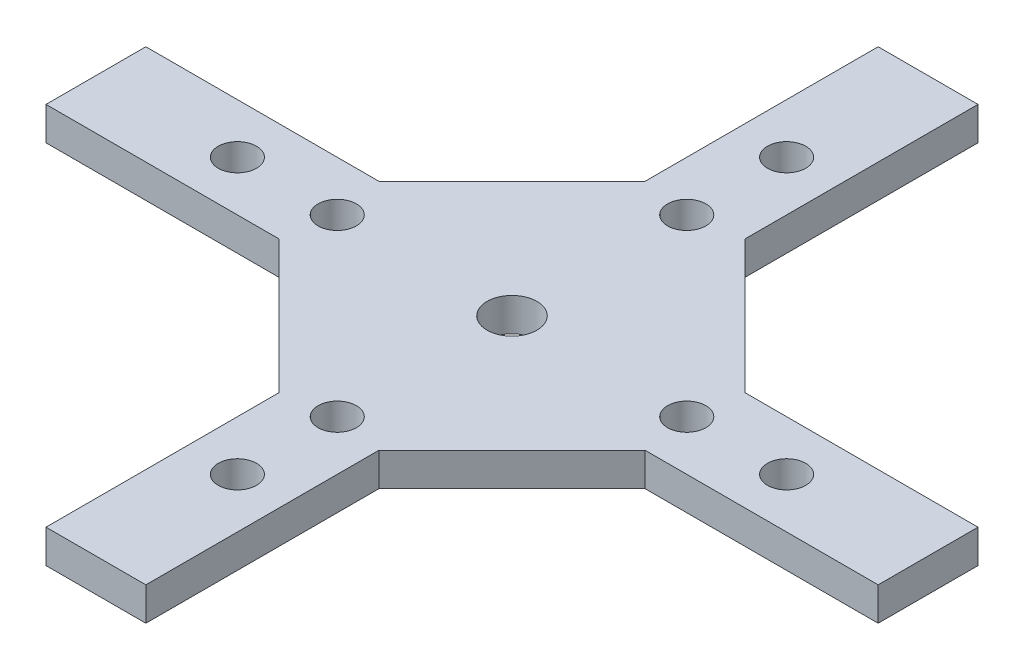
ISO-10303-21;
HEADER;
FILE_DESCRIPTION(('STEP AP214'),'2;1');
FILE_NAME('part.step','',(''),(''),'','','');
FILE_SCHEMA(('AUTOMOTIVE_DESIGN { 1 0 10303 214 1 1 1 1 }'));
ENDSEC;
DATA;
#1=APPLICATION_CONTEXT('core data for automotive mechanical design processes');
#2=APPLICATION_PROTOCOL_DEFINITION('international standard','automotive_design',2000,#1);
#3=PRODUCT_CONTEXT('',#1,'mechanical');
#4=PRODUCT('Part','Part','',(#3));
#5=PRODUCT_RELATED_PRODUCT_CATEGORY('part','',(#4));
#6=PRODUCT_DEFINITION_FORMATION('','',#4);
#7=PRODUCT_DEFINITION_CONTEXT('part definition',#1,'design');
#8=PRODUCT_DEFINITION('design','',#6,#7);
#9=PRODUCT_DEFINITION_SHAPE('','',#8);
#10=(LENGTH_UNIT() NAMED_UNIT(*) SI_UNIT(.MILLI.,.METRE.));
#11=(NAMED_UNIT(*) PLANE_ANGLE_UNIT() SI_UNIT($,.RADIAN.));
#12=(NAMED_UNIT(*) SI_UNIT($,.STERADIAN.) SOLID_ANGLE_UNIT());
#13=UNCERTAINTY_MEASURE_WITH_UNIT(LENGTH_MEASURE(1.E-05),#10,'distance_accuracy_value','');
#14=(GEOMETRIC_REPRESENTATION_CONTEXT(3) GLOBAL_UNCERTAINTY_ASSIGNED_CONTEXT((#13)) GLOBAL_UNIT_ASSIGNED_CONTEXT((#10,
#11,#12)) REPRESENTATION_CONTEXT('',''));
#15=CARTESIAN_POINT('',(0.,0.,0.));
#16=DIRECTION('',(0.,0.,1.));
#17=DIRECTION('',(1.,0.,0.));
#18=AXIS2_PLACEMENT_3D('',#15,#16,#17);
#19=CARTESIAN_POINT('',(0.,2.,3.));
#20=DIRECTION('',(0.,0.,-1.));
#21=DIRECTION('',(-1.,0.,0.));
#22=AXIS2_PLACEMENT_3D('',#19,#20,#21);
#23=PLANE('',#22);
#24=DIRECTION('',(1.,0.,0.));
#25=VECTOR('',#24,1.);
#26=CARTESIAN_POINT('',(0.,0.,3.));
#27=LINE('',#26,#25);
#28=CARTESIAN_POINT('',(-25.,0.,3.));
#29=VERTEX_POINT('',#28);
#30=CARTESIAN_POINT('',(-11.,0.,3.));
#31=VERTEX_POINT('',#30);
#32=EDGE_CURVE('E234',#29,#31,#27,.T.);
#33=ORIENTED_EDGE('',*,*,#32,.T.);
#34=DIRECTION('',(0.,1.,0.));
#35=VECTOR('',#34,1.);
#36=CARTESIAN_POINT('',(-11.,2.,3.));
#37=LINE('',#36,#35);
#38=CARTESIAN_POINT('',(-11.,2.,3.));
#39=VERTEX_POINT('',#38);
#40=EDGE_CURVE('E342',#31,#39,#37,.T.);
#41=ORIENTED_EDGE('',*,*,#40,.T.);
#42=DIRECTION('',(1.,0.,0.));
#43=VECTOR('',#42,1.);
#44=CARTESIAN_POINT('',(0.,2.,3.));
#45=LINE('',#44,#43);
#46=CARTESIAN_POINT('',(-25.,2.,3.));
#47=VERTEX_POINT('',#46);
#48=EDGE_CURVE('E192',#47,#39,#45,.T.);
#49=ORIENTED_EDGE('',*,*,#48,.F.);
#50=DIRECTION('',(0.,-1.,0.));
#51=VECTOR('',#50,1.);
#52=CARTESIAN_POINT('',(-25.,2.,3.));
#53=LINE('',#52,#51);
#54=EDGE_CURVE('E233',#47,#29,#53,.T.);
#55=ORIENTED_EDGE('',*,*,#54,.T.);
#56=EDGE_LOOP('',(#33,#41,#49,#55));
#57=FACE_BOUND('',#56,.T.);
#58=ADVANCED_FACE('F48',(#57),#23,.F.);
#59=CARTESIAN_POINT('',(-3.,2.,0.));
#60=DIRECTION('',(-1.,0.,0.));
#61=DIRECTION('',(0.,0.,1.));
#62=AXIS2_PLACEMENT_3D('',#59,#60,#61);
#63=PLANE('',#62);
#64=DIRECTION('',(0.,0.,-1.));
#65=VECTOR('',#64,1.);
#66=CARTESIAN_POINT('',(-3.,2.,0.));
#67=LINE('',#66,#65);
#68=CARTESIAN_POINT('',(-3.,2.,25.));
#69=VERTEX_POINT('',#68);
#70=CARTESIAN_POINT('',(-3.,2.,11.0000000000001));
#71=VERTEX_POINT('',#70);
#72=EDGE_CURVE('E166',#69,#71,#67,.T.);
#73=ORIENTED_EDGE('',*,*,#72,.T.);
#74=DIRECTION('',(0.,-1.,0.));
#75=VECTOR('',#74,1.);
#76=CARTESIAN_POINT('',(-3.,2.,11.0000000000001));
#77=LINE('',#76,#75);
#78=CARTESIAN_POINT('',(-3.,0.,11.0000000000001));
#79=VERTEX_POINT('',#78);
#80=EDGE_CURVE('E339',#71,#79,#77,.T.);
#81=ORIENTED_EDGE('',*,*,#80,.T.);
#82=DIRECTION('',(0.,0.,-1.));
#83=VECTOR('',#82,1.);
#84=CARTESIAN_POINT('',(-3.,0.,0.));
#85=LINE('',#84,#83);
#86=CARTESIAN_POINT('',(-3.,0.,25.));
#87=VERTEX_POINT('',#86);
#88=EDGE_CURVE('E169',#87,#79,#85,.T.);
#89=ORIENTED_EDGE('',*,*,#88,.F.);
#90=DIRECTION('',(0.,-1.,0.));
#91=VECTOR('',#90,1.);
#92=CARTESIAN_POINT('',(-3.,2.,25.));
#93=LINE('',#92,#91);
#94=EDGE_CURVE('E161',#69,#87,#93,.T.);
#95=ORIENTED_EDGE('',*,*,#94,.F.);
#96=EDGE_LOOP('',(#73,#81,#89,#95));
#97=FACE_BOUND('',#96,.T.);
#98=ADVANCED_FACE('F163',(#97),#63,.T.);
#99=CARTESIAN_POINT('',(0.,2.,25.));
#100=DIRECTION('',(0.,0.,-1.));
#101=DIRECTION('',(-1.,0.,0.));
#102=AXIS2_PLACEMENT_3D('',#99,#100,#101);
#103=PLANE('',#102);
#104=DIRECTION('',(1.,0.,0.));
#105=VECTOR('',#104,1.);
#106=CARTESIAN_POINT('',(0.,0.,25.));
#107=LINE('',#106,#105);
#108=CARTESIAN_POINT('',(3.,0.,25.));
#109=VERTEX_POINT('',#108);
#110=EDGE_CURVE('E241',#87,#109,#107,.T.);
#111=ORIENTED_EDGE('',*,*,#110,.T.);
#112=DIRECTION('',(0.,-1.,0.));
#113=VECTOR('',#112,1.);
#114=CARTESIAN_POINT('',(3.,2.,25.));
#115=LINE('',#114,#113);
#116=CARTESIAN_POINT('',(3.,2.,25.));
#117=VERTEX_POINT('',#116);
#118=EDGE_CURVE('E174',#117,#109,#115,.T.);
#119=ORIENTED_EDGE('',*,*,#118,.F.);
#120=DIRECTION('',(1.,0.,0.));
#121=VECTOR('',#120,1.);
#122=CARTESIAN_POINT('',(0.,2.,25.));
#123=LINE('',#122,#121);
#124=EDGE_CURVE('E177',#69,#117,#123,.T.);
#125=ORIENTED_EDGE('',*,*,#124,.F.);
#126=ORIENTED_EDGE('',*,*,#94,.T.);
#127=EDGE_LOOP('',(#111,#119,#125,#126));
#128=FACE_BOUND('',#127,.T.);
#129=ADVANCED_FACE('F178',(#128),#103,.F.);
#130=CARTESIAN_POINT('',(3.,2.,0.));
#131=DIRECTION('',(-1.,0.,0.));
#132=DIRECTION('',(0.,0.,1.));
#133=AXIS2_PLACEMENT_3D('',#130,#131,#132);
#134=PLANE('',#133);
#135=DIRECTION('',(0.,0.,-1.));
#136=VECTOR('',#135,1.);
#137=CARTESIAN_POINT('',(3.,0.,0.));
#138=LINE('',#137,#136);
#139=CARTESIAN_POINT('',(3.,0.,11.));
#140=VERTEX_POINT('',#139);
#141=EDGE_CURVE('E244',#109,#140,#138,.T.);
#142=ORIENTED_EDGE('',*,*,#141,.T.);
#143=DIRECTION('',(0.,1.,0.));
#144=VECTOR('',#143,1.);
#145=CARTESIAN_POINT('',(3.,2.,11.));
#146=LINE('',#145,#144);
#147=CARTESIAN_POINT('',(3.,2.,11.));
#148=VERTEX_POINT('',#147);
#149=EDGE_CURVE('E336',#140,#148,#146,.T.);
#150=ORIENTED_EDGE('',*,*,#149,.T.);
#151=DIRECTION('',(0.,0.,-1.));
#152=VECTOR('',#151,1.);
#153=CARTESIAN_POINT('',(3.,2.,0.));
#154=LINE('',#153,#152);
#155=EDGE_CURVE('E184',#117,#148,#154,.T.);
#156=ORIENTED_EDGE('',*,*,#155,.F.);
#157=ORIENTED_EDGE('',*,*,#118,.T.);
#158=EDGE_LOOP('',(#142,#150,#156,#157));
#159=FACE_BOUND('',#158,.T.);
#160=ADVANCED_FACE('F410',(#159),#134,.F.);
#161=CARTESIAN_POINT('',(0.,2.,3.));
#162=DIRECTION('',(0.,0.,-1.));
#163=DIRECTION('',(-1.,0.,0.));
#164=AXIS2_PLACEMENT_3D('',#161,#162,#163);
#165=PLANE('',#164);
#166=DIRECTION('',(1.,0.,0.));
#167=VECTOR('',#166,1.);
#168=CARTESIAN_POINT('',(0.,2.,3.));
#169=LINE('',#168,#167);
#170=CARTESIAN_POINT('',(11.0000000000001,2.,3.));
#171=VERTEX_POINT('',#170);
#172=CARTESIAN_POINT('',(25.,2.,3.));
#173=VERTEX_POINT('',#172);
#174=EDGE_CURVE('E201',#171,#173,#169,.T.);
#175=ORIENTED_EDGE('',*,*,#174,.F.);
#176=DIRECTION('',(0.,-1.,0.));
#177=VECTOR('',#176,1.);
#178=CARTESIAN_POINT('',(11.0000000000001,0.,3.));
#179=LINE('',#178,#177);
#180=CARTESIAN_POINT('',(11.0000000000001,0.,3.));
#181=VERTEX_POINT('',#180);
#182=EDGE_CURVE('E173',#171,#181,#179,.T.);
#183=ORIENTED_EDGE('',*,*,#182,.T.);
#184=DIRECTION('',(1.,0.,0.));
#185=VECTOR('',#184,1.);
#186=CARTESIAN_POINT('',(0.,0.,3.));
#187=LINE('',#186,#185);
#188=CARTESIAN_POINT('',(25.,0.,3.));
#189=VERTEX_POINT('',#188);
#190=EDGE_CURVE('E248',#181,#189,#187,.T.);
#191=ORIENTED_EDGE('',*,*,#190,.T.);
#192=DIRECTION('',(0.,-1.,0.));
#193=VECTOR('',#192,1.);
#194=CARTESIAN_POINT('',(25.,2.,3.));
#195=LINE('',#194,#193);
#196=EDGE_CURVE('E295',#173,#189,#195,.T.);
#197=ORIENTED_EDGE('',*,*,#196,.F.);
#198=EDGE_LOOP('',(#175,#183,#191,#197));
#199=FACE_BOUND('',#198,.T.);
#200=ADVANCED_FACE('F403',(#199),#165,.F.);
#201=CARTESIAN_POINT('',(25.,2.,0.));
#202=DIRECTION('',(-1.,0.,0.));
#203=DIRECTION('',(0.,0.,1.));
#204=AXIS2_PLACEMENT_3D('',#201,#202,#203);
#205=PLANE('',#204);
#206=DIRECTION('',(0.,0.,-1.));
#207=VECTOR('',#206,1.);
#208=CARTESIAN_POINT('',(25.,0.,0.));
#209=LINE('',#208,#207);
#210=CARTESIAN_POINT('',(25.,0.,-3.));
#211=VERTEX_POINT('',#210);
#212=EDGE_CURVE('E251',#189,#211,#209,.T.);
#213=ORIENTED_EDGE('',*,*,#212,.T.);
#214=DIRECTION('',(0.,-1.,0.));
#215=VECTOR('',#214,1.);
#216=CARTESIAN_POINT('',(25.,2.,-3.));
#217=LINE('',#216,#215);
#218=CARTESIAN_POINT('',(25.,2.,-3.));
#219=VERTEX_POINT('',#218);
#220=EDGE_CURVE('E291',#219,#211,#217,.T.);
#221=ORIENTED_EDGE('',*,*,#220,.F.);
#222=DIRECTION('',(0.,0.,-1.));
#223=VECTOR('',#222,1.);
#224=CARTESIAN_POINT('',(25.,2.,0.));
#225=LINE('',#224,#223);
#226=EDGE_CURVE('E204',#173,#219,#225,.T.);
#227=ORIENTED_EDGE('',*,*,#226,.F.);
#228=ORIENTED_EDGE('',*,*,#196,.T.);
#229=EDGE_LOOP('',(#213,#221,#227,#228));
#230=FACE_BOUND('',#229,.T.);
#231=ADVANCED_FACE('F397',(#230),#205,.F.);
#232=CARTESIAN_POINT('',(0.,2.,-3.));
#233=DIRECTION('',(0.,0.,-1.));
#234=DIRECTION('',(-1.,0.,0.));
#235=AXIS2_PLACEMENT_3D('',#232,#233,#234);
#236=PLANE('',#235);
#237=DIRECTION('',(1.,0.,0.));
#238=VECTOR('',#237,1.);
#239=CARTESIAN_POINT('',(0.,0.,-3.));
#240=LINE('',#239,#238);
#241=CARTESIAN_POINT('',(11.,0.,-3.));
#242=VERTEX_POINT('',#241);
#243=EDGE_CURVE('E255',#242,#211,#240,.T.);
#244=ORIENTED_EDGE('',*,*,#243,.F.);
#245=DIRECTION('',(0.,1.,0.));
#246=VECTOR('',#245,1.);
#247=CARTESIAN_POINT('',(11.,2.,-3.));
#248=LINE('',#247,#246);
#249=CARTESIAN_POINT('',(11.,2.,-3.));
#250=VERTEX_POINT('',#249);
#251=EDGE_CURVE('E349',#242,#250,#248,.T.);
#252=ORIENTED_EDGE('',*,*,#251,.T.);
#253=DIRECTION('',(1.,0.,0.));
#254=VECTOR('',#253,1.);
#255=CARTESIAN_POINT('',(0.,2.,-3.));
#256=LINE('',#255,#254);
#257=EDGE_CURVE('E208',#250,#219,#256,.T.);
#258=ORIENTED_EDGE('',*,*,#257,.T.);
#259=ORIENTED_EDGE('',*,*,#220,.T.);
#260=EDGE_LOOP('',(#244,#252,#258,#259));
#261=FACE_BOUND('',#260,.T.);
#262=ADVANCED_FACE('F393',(#261),#236,.T.);
#263=CARTESIAN_POINT('',(3.,2.,0.));
#264=DIRECTION('',(-1.,0.,0.));
#265=DIRECTION('',(0.,0.,1.));
#266=AXIS2_PLACEMENT_3D('',#263,#264,#265);
#267=PLANE('',#266);
#268=DIRECTION('',(0.,0.,-1.));
#269=VECTOR('',#268,1.);
#270=CARTESIAN_POINT('',(3.,2.,0.));
#271=LINE('',#270,#269);
#272=CARTESIAN_POINT('',(3.,2.,-11.0000000000001));
#273=VERTEX_POINT('',#272);
#274=CARTESIAN_POINT('',(3.,2.,-25.));
#275=VERTEX_POINT('',#274);
#276=EDGE_CURVE('E211',#273,#275,#271,.T.);
#277=ORIENTED_EDGE('',*,*,#276,.F.);
#278=DIRECTION('',(0.,-1.,0.));
#279=VECTOR('',#278,1.);
#280=CARTESIAN_POINT('',(3.,2.,-11.0000000000001));
#281=LINE('',#280,#279);
#282=CARTESIAN_POINT('',(3.,0.,-11.0000000000001));
#283=VERTEX_POINT('',#282);
#284=EDGE_CURVE('E345',#273,#283,#281,.T.);
#285=ORIENTED_EDGE('',*,*,#284,.T.);
#286=DIRECTION('',(0.,0.,-1.));
#287=VECTOR('',#286,1.);
#288=CARTESIAN_POINT('',(3.,0.,0.));
#289=LINE('',#288,#287);
#290=CARTESIAN_POINT('',(3.,0.,-25.));
#291=VERTEX_POINT('',#290);
#292=EDGE_CURVE('E258',#283,#291,#289,.T.);
#293=ORIENTED_EDGE('',*,*,#292,.T.);
#294=DIRECTION('',(0.,-1.,0.));
#295=VECTOR('',#294,1.);
#296=CARTESIAN_POINT('',(3.,2.,-25.));
#297=LINE('',#296,#295);
#298=EDGE_CURVE('E287',#275,#291,#297,.T.);
#299=ORIENTED_EDGE('',*,*,#298,.F.);
#300=EDGE_LOOP('',(#277,#285,#293,#299));
#301=FACE_BOUND('',#300,.T.);
#302=ADVANCED_FACE('F384',(#301),#267,.F.);
#303=CARTESIAN_POINT('',(0.,2.,-25.));
#304=DIRECTION('',(0.,0.,-1.));
#305=DIRECTION('',(-1.,0.,0.));
#306=AXIS2_PLACEMENT_3D('',#303,#304,#305);
#307=PLANE('',#306);
#308=DIRECTION('',(1.,0.,0.));
#309=VECTOR('',#308,1.);
#310=CARTESIAN_POINT('',(0.,0.,-25.));
#311=LINE('',#310,#309);
#312=CARTESIAN_POINT('',(-3.,0.,-25.));
#313=VERTEX_POINT('',#312);
#314=EDGE_CURVE('E261',#313,#291,#311,.T.);
#315=ORIENTED_EDGE('',*,*,#314,.F.);
#316=DIRECTION('',(0.,-1.,0.));
#317=VECTOR('',#316,1.);
#318=CARTESIAN_POINT('',(-3.,2.,-25.));
#319=LINE('',#318,#317);
#320=CARTESIAN_POINT('',(-3.,2.,-25.));
#321=VERTEX_POINT('',#320);
#322=EDGE_CURVE('E283',#321,#313,#319,.T.);
#323=ORIENTED_EDGE('',*,*,#322,.F.);
#324=DIRECTION('',(1.,0.,0.));
#325=VECTOR('',#324,1.);
#326=CARTESIAN_POINT('',(0.,2.,-25.));
#327=LINE('',#326,#325);
#328=EDGE_CURVE('E214',#321,#275,#327,.T.);
#329=ORIENTED_EDGE('',*,*,#328,.T.);
#330=ORIENTED_EDGE('',*,*,#298,.T.);
#331=EDGE_LOOP('',(#315,#323,#329,#330));
#332=FACE_BOUND('',#331,.T.);
#333=ADVANCED_FACE('F456',(#332),#307,.T.);
#334=CARTESIAN_POINT('',(-3.,2.,0.));
#335=DIRECTION('',(-1.,0.,0.));
#336=DIRECTION('',(0.,0.,1.));
#337=AXIS2_PLACEMENT_3D('',#334,#335,#336);
#338=PLANE('',#337);
#339=DIRECTION('',(0.,0.,-1.));
#340=VECTOR('',#339,1.);
#341=CARTESIAN_POINT('',(-3.,0.,0.));
#342=LINE('',#341,#340);
#343=CARTESIAN_POINT('',(-3.,0.,-11.));
#344=VERTEX_POINT('',#343);
#345=EDGE_CURVE('E265',#344,#313,#342,.T.);
#346=ORIENTED_EDGE('',*,*,#345,.F.);
#347=DIRECTION('',(0.,1.,0.));
#348=VECTOR('',#347,1.);
#349=CARTESIAN_POINT('',(-3.,2.,-11.));
#350=LINE('',#349,#348);
#351=CARTESIAN_POINT('',(-3.,2.,-11.));
#352=VERTEX_POINT('',#351);
#353=EDGE_CURVE('E65',#344,#352,#350,.T.);
#354=ORIENTED_EDGE('',*,*,#353,.T.);
#355=DIRECTION('',(0.,0.,-1.));
#356=VECTOR('',#355,1.);
#357=CARTESIAN_POINT('',(-3.,2.,0.));
#358=LINE('',#357,#356);
#359=EDGE_CURVE('E218',#352,#321,#358,.T.);
#360=ORIENTED_EDGE('',*,*,#359,.T.);
#361=ORIENTED_EDGE('',*,*,#322,.T.);
#362=EDGE_LOOP('',(#346,#354,#360,#361));
#363=FACE_BOUND('',#362,.T.);
#364=ADVANCED_FACE('F459',(#363),#338,.T.);
#365=CARTESIAN_POINT('',(0.,2.,-3.));
#366=DIRECTION('',(0.,0.,-1.));
#367=DIRECTION('',(-1.,0.,0.));
#368=AXIS2_PLACEMENT_3D('',#365,#366,#367);
#369=PLANE('',#368);
#370=DIRECTION('',(1.,0.,0.));
#371=VECTOR('',#370,1.);
#372=CARTESIAN_POINT('',(0.,2.,-3.));
#373=LINE('',#372,#371);
#374=CARTESIAN_POINT('',(-25.,2.,-3.));
#375=VERTEX_POINT('',#374);
#376=CARTESIAN_POINT('',(-11.0000000000001,2.,-3.));
#377=VERTEX_POINT('',#376);
#378=EDGE_CURVE('E221',#375,#377,#373,.T.);
#379=ORIENTED_EDGE('',*,*,#378,.T.);
#380=DIRECTION('',(0.,-1.,0.));
#381=VECTOR('',#380,1.);
#382=CARTESIAN_POINT('',(-11.0000000000001,0.,-3.));
#383=LINE('',#382,#381);
#384=CARTESIAN_POINT('',(-11.0000000000001,0.,-3.));
#385=VERTEX_POINT('',#384);
#386=EDGE_CURVE('E352',#377,#385,#383,.T.);
#387=ORIENTED_EDGE('',*,*,#386,.T.);
#388=DIRECTION('',(1.,0.,0.));
#389=VECTOR('',#388,1.);
#390=CARTESIAN_POINT('',(0.,0.,-3.));
#391=LINE('',#390,#389);
#392=CARTESIAN_POINT('',(-25.,0.,-3.));
#393=VERTEX_POINT('',#392);
#394=EDGE_CURVE('E268',#393,#385,#391,.T.);
#395=ORIENTED_EDGE('',*,*,#394,.F.);
#396=DIRECTION('',(0.,-1.,0.));
#397=VECTOR('',#396,1.);
#398=CARTESIAN_POINT('',(-25.,2.,-3.));
#399=LINE('',#398,#397);
#400=EDGE_CURVE('E280',#375,#393,#399,.T.);
#401=ORIENTED_EDGE('',*,*,#400,.F.);
#402=EDGE_LOOP('',(#379,#387,#395,#401));
#403=FACE_BOUND('',#402,.T.);
#404=ADVANCED_FACE('F463',(#403),#369,.T.);
#405=CARTESIAN_POINT('',(-25.,2.,0.));
#406=DIRECTION('',(-1.,0.,0.));
#407=DIRECTION('',(0.,0.,1.));
#408=AXIS2_PLACEMENT_3D('',#405,#406,#407);
#409=PLANE('',#408);
#410=DIRECTION('',(0.,0.,-1.));
#411=VECTOR('',#410,1.);
#412=CARTESIAN_POINT('',(-25.,0.,0.));
#413=LINE('',#412,#411);
#414=EDGE_CURVE('E271',#29,#393,#413,.T.);
#415=ORIENTED_EDGE('',*,*,#414,.F.);
#416=ORIENTED_EDGE('',*,*,#54,.F.);
#417=DIRECTION('',(0.,0.,-1.));
#418=VECTOR('',#417,1.);
#419=CARTESIAN_POINT('',(-25.,2.,0.));
#420=LINE('',#419,#418);
#421=EDGE_CURVE('E225',#47,#375,#420,.T.);
#422=ORIENTED_EDGE('',*,*,#421,.T.);
#423=ORIENTED_EDGE('',*,*,#400,.T.);
#424=EDGE_LOOP('',(#415,#416,#422,#423));
#425=FACE_BOUND('',#424,.T.);
#426=ADVANCED_FACE('F466',(#425),#409,.T.);
#427=CARTESIAN_POINT('',(0.,2.,0.));
#428=DIRECTION('',(0.,-1.,0.));
#429=DIRECTION('',(0.,0.,-1.));
#430=AXIS2_PLACEMENT_3D('',#427,#428,#429);
#431=CYLINDRICAL_SURFACE('',#430,1.5);
#432=CARTESIAN_POINT('',(0.,2.,0.));
#433=DIRECTION('',(0.,1.,0.));
#434=DIRECTION('',(0.,0.,1.));
#435=AXIS2_PLACEMENT_3D('',#432,#433,#434);
#436=CIRCLE('',#435,1.5);
#437=CARTESIAN_POINT('',(0.,2.,1.5));
#438=VERTEX_POINT('',#437);
#439=EDGE_CURVE('E229',#438,#438,#436,.T.);
#440=ORIENTED_EDGE('',*,*,#439,.T.);
#441=EDGE_LOOP('',(#440));
#442=FACE_BOUND('',#441,.T.);
#443=CARTESIAN_POINT('',(0.,0.,0.));
#444=DIRECTION('',(0.,1.,0.));
#445=DIRECTION('',(0.,0.,1.));
#446=AXIS2_PLACEMENT_3D('',#443,#444,#445);
#447=CIRCLE('',#446,1.5);
#448=CARTESIAN_POINT('',(0.,0.,1.5));
#449=VERTEX_POINT('',#448);
#450=EDGE_CURVE('E195',#449,#449,#447,.T.);
#451=ORIENTED_EDGE('',*,*,#450,.F.);
#452=EDGE_LOOP('',(#451));
#453=FACE_BOUND('',#452,.T.);
#454=ADVANCED_FACE('F470',(#442,#453),#431,.F.);
#455=CARTESIAN_POINT('',(0.,2.,0.));
#456=DIRECTION('',(0.,1.,0.));
#457=DIRECTION('',(0.,0.,1.));
#458=AXIS2_PLACEMENT_3D('',#455,#456,#457);
#459=PLANE('',#458);
#460=CARTESIAN_POINT('',(1.5255856013063E-12,2.,10.5));
#461=DIRECTION('',(0.,1.,0.));
#462=DIRECTION('',(0.,0.,1.));
#463=AXIS2_PLACEMENT_3D('',#460,#461,#462);
#464=CIRCLE('',#463,1.15000000000153);
#465=CARTESIAN_POINT('',(1.5255856013063E-12,2.,11.6500000000015));
#466=VERTEX_POINT('',#465);
#467=EDGE_CURVE('E529',#466,#466,#464,.T.);
#468=ORIENTED_EDGE('',*,*,#467,.F.);
#469=EDGE_LOOP('',(#468));
#470=FACE_BOUND('',#469,.T.);
#471=CARTESIAN_POINT('',(16.5000000000008,2.,-7.63160194692895E-13));
#472=DIRECTION('',(0.,1.,0.));
#473=DIRECTION('',(0.,0.,1.));
#474=AXIS2_PLACEMENT_3D('',#471,#472,#473);
#475=CIRCLE('',#474,1.15000000000056);
#476=CARTESIAN_POINT('',(16.5000000000008,2.,1.1499999999998));
#477=VERTEX_POINT('',#476);
#478=EDGE_CURVE('E535',#477,#477,#475,.T.);
#479=ORIENTED_EDGE('',*,*,#478,.F.);
#480=EDGE_LOOP('',(#479));
#481=FACE_BOUND('',#480,.T.);
#482=CARTESIAN_POINT('',(10.5000000000008,2.,-7.62792800653151E-13));
#483=DIRECTION('',(0.,1.,0.));
#484=DIRECTION('',(0.,0.,1.));
#485=AXIS2_PLACEMENT_3D('',#482,#483,#484);
#486=CIRCLE('',#485,1.15000000000054);
#487=CARTESIAN_POINT('',(10.5000000000008,2.,1.14999999999978));
#488=VERTEX_POINT('',#487);
#489=EDGE_CURVE('E546',#488,#488,#486,.T.);
#490=ORIENTED_EDGE('',*,*,#489,.F.);
#491=EDGE_LOOP('',(#490));
#492=FACE_BOUND('',#491,.T.);
#493=CARTESIAN_POINT('',(0.,2.,-16.5));
#494=DIRECTION('',(0.,1.,0.));
#495=DIRECTION('',(0.,0.,1.));
#496=AXIS2_PLACEMENT_3D('',#493,#494,#495);
#497=CIRCLE('',#496,1.15);
#498=CARTESIAN_POINT('',(0.,2.,-15.35));
#499=VERTEX_POINT('',#498);
#500=EDGE_CURVE('E548',#499,#499,#497,.T.);
#501=ORIENTED_EDGE('',*,*,#500,.F.);
#502=EDGE_LOOP('',(#501));
#503=FACE_BOUND('',#502,.T.);
#504=CARTESIAN_POINT('',(1.52632038938579E-12,2.,16.5));
#505=DIRECTION('',(0.,1.,0.));
#506=DIRECTION('',(0.,0.,1.));
#507=AXIS2_PLACEMENT_3D('',#504,#505,#506);
#508=CIRCLE('',#507,1.15000000000157);
#509=CARTESIAN_POINT('',(1.52632038938579E-12,2.,17.6500000000016));
#510=VERTEX_POINT('',#509);
#511=EDGE_CURVE('E515',#510,#510,#508,.T.);
#512=ORIENTED_EDGE('',*,*,#511,.F.);
#513=EDGE_LOOP('',(#512));
#514=FACE_BOUND('',#513,.T.);
#515=CARTESIAN_POINT('',(-10.4999999999992,2.,7.61506921514046E-13));
#516=DIRECTION('',(0.,1.,0.));
#517=DIRECTION('',(0.,0.,1.));
#518=AXIS2_PLACEMENT_3D('',#515,#516,#517);
#519=CIRCLE('',#518,1.15000000000106);
#520=CARTESIAN_POINT('',(-10.4999999999992,2.,1.15000000000182));
#521=VERTEX_POINT('',#520);
#522=EDGE_CURVE('E530',#521,#521,#519,.T.);
#523=ORIENTED_EDGE('',*,*,#522,.F.);
#524=EDGE_LOOP('',(#523));
#525=FACE_BOUND('',#524,.T.);
#526=CARTESIAN_POINT('',(-16.4999999999992,2.,7.61139527474302E-13));
#527=DIRECTION('',(0.,1.,0.));
#528=DIRECTION('',(0.,0.,1.));
#529=AXIS2_PLACEMENT_3D('',#526,#527,#528);
#530=CIRCLE('',#529,1.15000000000112);
#531=CARTESIAN_POINT('',(-16.4999999999992,2.,1.15000000000188));
#532=VERTEX_POINT('',#531);
#533=EDGE_CURVE('E538',#532,#532,#530,.T.);
#534=ORIENTED_EDGE('',*,*,#533,.F.);
#535=EDGE_LOOP('',(#534));
#536=FACE_BOUND('',#535,.T.);
#537=CARTESIAN_POINT('',(0.,2.,-10.5));
#538=DIRECTION('',(0.,1.,0.));
#539=DIRECTION('',(0.,0.,1.));
#540=AXIS2_PLACEMENT_3D('',#537,#538,#539);
#541=CIRCLE('',#540,1.15);
#542=CARTESIAN_POINT('',(0.,2.,-9.35));
#543=VERTEX_POINT('',#542);
#544=EDGE_CURVE('E306',#543,#543,#541,.T.);
#545=ORIENTED_EDGE('',*,*,#544,.F.);
#546=EDGE_LOOP('',(#545));
#547=FACE_BOUND('',#546,.T.);
#548=ORIENTED_EDGE('',*,*,#48,.T.);
#549=DIRECTION('',(0.707106781186544,0.,0.707106781186552));
#550=VECTOR('',#549,1.);
#551=CARTESIAN_POINT('',(-3.,2.,11.0000000000001));
#552=LINE('',#551,#550);
#553=EDGE_CURVE('E190',#39,#71,#552,.T.);
#554=ORIENTED_EDGE('',*,*,#553,.T.);
#555=ORIENTED_EDGE('',*,*,#72,.F.);
#556=ORIENTED_EDGE('',*,*,#124,.T.);
#557=ORIENTED_EDGE('',*,*,#155,.T.);
#558=DIRECTION('',(-0.707106781186552,0.,0.707106781186544));
#559=VECTOR('',#558,1.);
#560=CARTESIAN_POINT('',(11.0000000000001,2.,3.));
#561=LINE('',#560,#559);
#562=EDGE_CURVE('E361',#148,#171,#561,.F.);
#563=ORIENTED_EDGE('',*,*,#562,.T.);
#564=ORIENTED_EDGE('',*,*,#174,.T.);
#565=ORIENTED_EDGE('',*,*,#226,.T.);
#566=ORIENTED_EDGE('',*,*,#257,.F.);
#567=DIRECTION('',(-0.707106781186544,0.,-0.707106781186552));
#568=VECTOR('',#567,1.);
#569=CARTESIAN_POINT('',(3.,2.,-11.0000000000001));
#570=LINE('',#569,#568);
#571=EDGE_CURVE('E372',#250,#273,#570,.T.);
#572=ORIENTED_EDGE('',*,*,#571,.T.);
#573=ORIENTED_EDGE('',*,*,#276,.T.);
#574=ORIENTED_EDGE('',*,*,#328,.F.);
#575=ORIENTED_EDGE('',*,*,#359,.F.);
#576=DIRECTION('',(0.707106781186552,0.,-0.707106781186544));
#577=VECTOR('',#576,1.);
#578=CARTESIAN_POINT('',(-11.0000000000001,2.,-3.));
#579=LINE('',#578,#577);
#580=EDGE_CURVE('E11',#352,#377,#579,.F.);
#581=ORIENTED_EDGE('',*,*,#580,.T.);
#582=ORIENTED_EDGE('',*,*,#378,.F.);
#583=ORIENTED_EDGE('',*,*,#421,.F.);
#584=EDGE_LOOP('',(#548,#554,#555,#556,#557,#563,#564,#565,#566,#572,#573,#574,#575,#581,#582,#583));
#585=FACE_BOUND('',#584,.T.);
#586=ORIENTED_EDGE('',*,*,#439,.F.);
#587=EDGE_LOOP('',(#586));
#588=FACE_BOUND('',#587,.T.);
#589=ADVANCED_FACE('F187',(#470,#481,#492,#503,#514,#525,#536,#547,#585,#588),#459,.T.);
#590=CARTESIAN_POINT('',(0.,0.,0.));
#591=DIRECTION('',(0.,1.,0.));
#592=DIRECTION('',(0.,0.,1.));
#593=AXIS2_PLACEMENT_3D('',#590,#591,#592);
#594=PLANE('',#593);
#595=CARTESIAN_POINT('',(1.5255856013063E-12,0.,10.5));
#596=DIRECTION('',(0.,1.,0.));
#597=DIRECTION('',(0.,0.,1.));
#598=AXIS2_PLACEMENT_3D('',#595,#596,#597);
#599=CIRCLE('',#598,1.15000000000153);
#600=CARTESIAN_POINT('',(1.5255856013063E-12,0.,11.6500000000015));
#601=VERTEX_POINT('',#600);
#602=EDGE_CURVE('E238',#601,#601,#599,.T.);
#603=ORIENTED_EDGE('',*,*,#602,.T.);
#604=EDGE_LOOP('',(#603));
#605=FACE_BOUND('',#604,.T.);
#606=CARTESIAN_POINT('',(16.5000000000008,0.,-7.63160194692895E-13));
#607=DIRECTION('',(0.,1.,0.));
#608=DIRECTION('',(0.,0.,1.));
#609=AXIS2_PLACEMENT_3D('',#606,#607,#608);
#610=CIRCLE('',#609,1.15000000000056);
#611=CARTESIAN_POINT('',(16.5000000000008,0.,1.1499999999998));
#612=VERTEX_POINT('',#611);
#613=EDGE_CURVE('E326',#612,#612,#610,.T.);
#614=ORIENTED_EDGE('',*,*,#613,.T.);
#615=EDGE_LOOP('',(#614));
#616=FACE_BOUND('',#615,.T.);
#617=CARTESIAN_POINT('',(10.5000000000008,0.,-7.62792800653151E-13));
#618=DIRECTION('',(0.,1.,0.));
#619=DIRECTION('',(0.,0.,1.));
#620=AXIS2_PLACEMENT_3D('',#617,#618,#619);
#621=CIRCLE('',#620,1.15000000000054);
#622=CARTESIAN_POINT('',(10.5000000000008,0.,1.14999999999978));
#623=VERTEX_POINT('',#622);
#624=EDGE_CURVE('E322',#623,#623,#621,.T.);
#625=ORIENTED_EDGE('',*,*,#624,.T.);
#626=EDGE_LOOP('',(#625));
#627=FACE_BOUND('',#626,.T.);
#628=CARTESIAN_POINT('',(0.,0.,-16.5));
#629=DIRECTION('',(0.,1.,0.));
#630=DIRECTION('',(0.,0.,1.));
#631=AXIS2_PLACEMENT_3D('',#628,#629,#630);
#632=CIRCLE('',#631,1.15);
#633=CARTESIAN_POINT('',(0.,0.,-15.35));
#634=VERTEX_POINT('',#633);
#635=EDGE_CURVE('E318',#634,#634,#632,.T.);
#636=ORIENTED_EDGE('',*,*,#635,.T.);
#637=EDGE_LOOP('',(#636));
#638=FACE_BOUND('',#637,.T.);
#639=CARTESIAN_POINT('',(1.52632038938579E-12,0.,16.5));
#640=DIRECTION('',(0.,1.,0.));
#641=DIRECTION('',(0.,0.,1.));
#642=AXIS2_PLACEMENT_3D('',#639,#640,#641);
#643=CIRCLE('',#642,1.15000000000157);
#644=CARTESIAN_POINT('',(1.52632038938579E-12,0.,17.6500000000016));
#645=VERTEX_POINT('',#644);
#646=EDGE_CURVE('E314',#645,#645,#643,.T.);
#647=ORIENTED_EDGE('',*,*,#646,.T.);
#648=EDGE_LOOP('',(#647));
#649=FACE_BOUND('',#648,.T.);
#650=CARTESIAN_POINT('',(-10.4999999999992,0.,7.61506921514046E-13));
#651=DIRECTION('',(0.,1.,0.));
#652=DIRECTION('',(0.,0.,1.));
#653=AXIS2_PLACEMENT_3D('',#650,#651,#652);
#654=CIRCLE('',#653,1.15000000000106);
#655=CARTESIAN_POINT('',(-10.4999999999992,0.,1.15000000000182));
#656=VERTEX_POINT('',#655);
#657=EDGE_CURVE('E310',#656,#656,#654,.T.);
#658=ORIENTED_EDGE('',*,*,#657,.T.);
#659=EDGE_LOOP('',(#658));
#660=FACE_BOUND('',#659,.T.);
#661=CARTESIAN_POINT('',(-16.4999999999992,0.,7.61139527474302E-13));
#662=DIRECTION('',(0.,1.,0.));
#663=DIRECTION('',(0.,0.,1.));
#664=AXIS2_PLACEMENT_3D('',#661,#662,#663);
#665=CIRCLE('',#664,1.15000000000112);
#666=CARTESIAN_POINT('',(-16.4999999999992,0.,1.15000000000188));
#667=VERTEX_POINT('',#666);
#668=EDGE_CURVE('E305',#667,#667,#665,.T.);
#669=ORIENTED_EDGE('',*,*,#668,.T.);
#670=EDGE_LOOP('',(#669));
#671=FACE_BOUND('',#670,.T.);
#672=CARTESIAN_POINT('',(0.,0.,-10.5));
#673=DIRECTION('',(0.,1.,0.));
#674=DIRECTION('',(0.,0.,1.));
#675=AXIS2_PLACEMENT_3D('',#672,#673,#674);
#676=CIRCLE('',#675,1.15);
#677=CARTESIAN_POINT('',(0.,0.,-9.35));
#678=VERTEX_POINT('',#677);
#679=EDGE_CURVE('E301',#678,#678,#676,.T.);
#680=ORIENTED_EDGE('',*,*,#679,.T.);
#681=EDGE_LOOP('',(#680));
#682=FACE_BOUND('',#681,.T.);
#683=ORIENTED_EDGE('',*,*,#32,.F.);
#684=ORIENTED_EDGE('',*,*,#414,.T.);
#685=ORIENTED_EDGE('',*,*,#394,.T.);
#686=DIRECTION('',(-0.707106781186552,0.,0.707106781186544));
#687=VECTOR('',#686,1.);
#688=CARTESIAN_POINT('',(-6.99999999999997,0.,-7.00000000000004));
#689=LINE('',#688,#687);
#690=EDGE_CURVE('E58',#385,#344,#689,.F.);
#691=ORIENTED_EDGE('',*,*,#690,.T.);
#692=ORIENTED_EDGE('',*,*,#345,.T.);
#693=ORIENTED_EDGE('',*,*,#314,.T.);
#694=ORIENTED_EDGE('',*,*,#292,.F.);
#695=DIRECTION('',(0.707106781186544,0.,0.707106781186552));
#696=VECTOR('',#695,1.);
#697=CARTESIAN_POINT('',(7.00000000000004,0.,-6.99999999999997));
#698=LINE('',#697,#696);
#699=EDGE_CURVE('E369',#283,#242,#698,.T.);
#700=ORIENTED_EDGE('',*,*,#699,.T.);
#701=ORIENTED_EDGE('',*,*,#243,.T.);
#702=ORIENTED_EDGE('',*,*,#212,.F.);
#703=ORIENTED_EDGE('',*,*,#190,.F.);
#704=DIRECTION('',(0.707106781186552,0.,-0.707106781186544));
#705=VECTOR('',#704,1.);
#706=CARTESIAN_POINT('',(6.99999999999997,0.,7.00000000000004));
#707=LINE('',#706,#705);
#708=EDGE_CURVE('E358',#181,#140,#707,.F.);
#709=ORIENTED_EDGE('',*,*,#708,.T.);
#710=ORIENTED_EDGE('',*,*,#141,.F.);
#711=ORIENTED_EDGE('',*,*,#110,.F.);
#712=ORIENTED_EDGE('',*,*,#88,.T.);
#713=DIRECTION('',(-0.707106781186544,0.,-0.707106781186552));
#714=VECTOR('',#713,1.);
#715=CARTESIAN_POINT('',(-7.00000000000004,0.,6.99999999999997));
#716=LINE('',#715,#714);
#717=EDGE_CURVE('E364',#79,#31,#716,.T.);
#718=ORIENTED_EDGE('',*,*,#717,.T.);
#719=EDGE_LOOP('',(#683,#684,#685,#691,#692,#693,#694,#700,#701,#702,#703,#709,#710,#711,#712,#718));
#720=FACE_BOUND('',#719,.T.);
#721=ORIENTED_EDGE('',*,*,#450,.T.);
#722=EDGE_LOOP('',(#721));
#723=FACE_BOUND('',#722,.T.);
#724=ADVANCED_FACE('F389',(#605,#616,#627,#638,#649,#660,#671,#682,#720,#723),#594,.F.);
#725=CARTESIAN_POINT('',(0.,-10.,-10.5));
#726=DIRECTION('',(0.,1.,0.));
#727=DIRECTION('',(0.,0.,1.));
#728=AXIS2_PLACEMENT_3D('',#725,#726,#727);
#729=CYLINDRICAL_SURFACE('',#728,1.15);
#730=ORIENTED_EDGE('',*,*,#544,.T.);
#731=EDGE_LOOP('',(#730));
#732=FACE_BOUND('',#731,.T.);
#733=ORIENTED_EDGE('',*,*,#679,.F.);
#734=EDGE_LOOP('',(#733));
#735=FACE_BOUND('',#734,.T.);
#736=ADVANCED_FACE('F477',(#732,#735),#729,.F.);
#737=CARTESIAN_POINT('',(-16.4999999999992,-10.,7.61139527474302E-13));
#738=DIRECTION('',(0.,1.,0.));
#739=DIRECTION('',(0.,0.,1.));
#740=AXIS2_PLACEMENT_3D('',#737,#738,#739);
#741=CYLINDRICAL_SURFACE('',#740,1.15000000000112);
#742=ORIENTED_EDGE('',*,*,#533,.T.);
#743=EDGE_LOOP('',(#742));
#744=FACE_BOUND('',#743,.T.);
#745=ORIENTED_EDGE('',*,*,#668,.F.);
#746=EDGE_LOOP('',(#745));
#747=FACE_BOUND('',#746,.T.);
#748=ADVANCED_FACE('F484',(#744,#747),#741,.F.);
#749=CARTESIAN_POINT('',(-10.4999999999992,-10.,7.61506921514046E-13));
#750=DIRECTION('',(0.,1.,0.));
#751=DIRECTION('',(0.,0.,1.));
#752=AXIS2_PLACEMENT_3D('',#749,#750,#751);
#753=CYLINDRICAL_SURFACE('',#752,1.15000000000106);
#754=ORIENTED_EDGE('',*,*,#522,.T.);
#755=EDGE_LOOP('',(#754));
#756=FACE_BOUND('',#755,.T.);
#757=ORIENTED_EDGE('',*,*,#657,.F.);
#758=EDGE_LOOP('',(#757));
#759=FACE_BOUND('',#758,.T.);
#760=ADVANCED_FACE('F503',(#756,#759),#753,.F.);
#761=CARTESIAN_POINT('',(1.52632038938579E-12,-10.,16.5));
#762=DIRECTION('',(0.,1.,0.));
#763=DIRECTION('',(0.,0.,1.));
#764=AXIS2_PLACEMENT_3D('',#761,#762,#763);
#765=CYLINDRICAL_SURFACE('',#764,1.15000000000157);
#766=ORIENTED_EDGE('',*,*,#511,.T.);
#767=EDGE_LOOP('',(#766));
#768=FACE_BOUND('',#767,.T.);
#769=ORIENTED_EDGE('',*,*,#646,.F.);
#770=EDGE_LOOP('',(#769));
#771=FACE_BOUND('',#770,.T.);
#772=ADVANCED_FACE('F494',(#768,#771),#765,.F.);
#773=CARTESIAN_POINT('',(0.,-10.,-16.5));
#774=DIRECTION('',(0.,1.,0.));
#775=DIRECTION('',(0.,0.,1.));
#776=AXIS2_PLACEMENT_3D('',#773,#774,#775);
#777=CYLINDRICAL_SURFACE('',#776,1.15);
#778=ORIENTED_EDGE('',*,*,#500,.T.);
#779=EDGE_LOOP('',(#778));
#780=FACE_BOUND('',#779,.T.);
#781=ORIENTED_EDGE('',*,*,#635,.F.);
#782=EDGE_LOOP('',(#781));
#783=FACE_BOUND('',#782,.T.);
#784=ADVANCED_FACE('F490',(#780,#783),#777,.F.);
#785=CARTESIAN_POINT('',(10.5000000000008,-10.,-7.62792800653151E-13));
#786=DIRECTION('',(0.,1.,0.));
#787=DIRECTION('',(0.,0.,1.));
#788=AXIS2_PLACEMENT_3D('',#785,#786,#787);
#789=CYLINDRICAL_SURFACE('',#788,1.15000000000054);
#790=ORIENTED_EDGE('',*,*,#489,.T.);
#791=EDGE_LOOP('',(#790));
#792=FACE_BOUND('',#791,.T.);
#793=ORIENTED_EDGE('',*,*,#624,.F.);
#794=EDGE_LOOP('',(#793));
#795=FACE_BOUND('',#794,.T.);
#796=ADVANCED_FACE('F486',(#792,#795),#789,.F.);
#797=CARTESIAN_POINT('',(16.5000000000008,-10.,-7.63160194692895E-13));
#798=DIRECTION('',(0.,1.,0.));
#799=DIRECTION('',(0.,0.,1.));
#800=AXIS2_PLACEMENT_3D('',#797,#798,#799);
#801=CYLINDRICAL_SURFACE('',#800,1.15000000000056);
#802=ORIENTED_EDGE('',*,*,#478,.T.);
#803=EDGE_LOOP('',(#802));
#804=FACE_BOUND('',#803,.T.);
#805=ORIENTED_EDGE('',*,*,#613,.F.);
#806=EDGE_LOOP('',(#805));
#807=FACE_BOUND('',#806,.T.);
#808=ADVANCED_FACE('F489',(#804,#807),#801,.F.);
#809=CARTESIAN_POINT('',(1.5255856013063E-12,-10.,10.5));
#810=DIRECTION('',(0.,1.,0.));
#811=DIRECTION('',(0.,0.,1.));
#812=AXIS2_PLACEMENT_3D('',#809,#810,#811);
#813=CYLINDRICAL_SURFACE('',#812,1.15000000000153);
#814=ORIENTED_EDGE('',*,*,#467,.T.);
#815=EDGE_LOOP('',(#814));
#816=FACE_BOUND('',#815,.T.);
#817=ORIENTED_EDGE('',*,*,#602,.F.);
#818=EDGE_LOOP('',(#817));
#819=FACE_BOUND('',#818,.T.);
#820=ADVANCED_FACE('F423',(#816,#819),#813,.F.);
#821=CARTESIAN_POINT('',(11.0000000000001,2.,3.));
#822=DIRECTION('',(0.707106781186543,0.,0.707106781186551));
#823=DIRECTION('',(0.,1.,0.));
#824=AXIS2_PLACEMENT_3D('',#821,#822,#823);
#825=PLANE('',#824);
#826=ORIENTED_EDGE('',*,*,#562,.F.);
#827=ORIENTED_EDGE('',*,*,#149,.F.);
#828=ORIENTED_EDGE('',*,*,#708,.F.);
#829=ORIENTED_EDGE('',*,*,#182,.F.);
#830=EDGE_LOOP('',(#826,#827,#828,#829));
#831=FACE_BOUND('',#830,.T.);
#832=ADVANCED_FACE('F407',(#831),#825,.T.);
#833=CARTESIAN_POINT('',(-3.,2.,11.0000000000001));
#834=DIRECTION('',(0.707106781186551,0.,-0.707106781186543));
#835=DIRECTION('',(0.,-1.,0.));
#836=AXIS2_PLACEMENT_3D('',#833,#834,#835);
#837=PLANE('',#836);
#838=ORIENTED_EDGE('',*,*,#553,.F.);
#839=ORIENTED_EDGE('',*,*,#40,.F.);
#840=ORIENTED_EDGE('',*,*,#717,.F.);
#841=ORIENTED_EDGE('',*,*,#80,.F.);
#842=EDGE_LOOP('',(#838,#839,#840,#841));
#843=FACE_BOUND('',#842,.T.);
#844=ADVANCED_FACE('F416',(#843),#837,.F.);
#845=CARTESIAN_POINT('',(3.,2.,-11.0000000000001));
#846=DIRECTION('',(-0.707106781186551,0.,0.707106781186543));
#847=DIRECTION('',(0.,-1.,0.));
#848=AXIS2_PLACEMENT_3D('',#845,#846,#847);
#849=PLANE('',#848);
#850=ORIENTED_EDGE('',*,*,#571,.F.);
#851=ORIENTED_EDGE('',*,*,#251,.F.);
#852=ORIENTED_EDGE('',*,*,#699,.F.);
#853=ORIENTED_EDGE('',*,*,#284,.F.);
#854=EDGE_LOOP('',(#850,#851,#852,#853));
#855=FACE_BOUND('',#854,.T.);
#856=ADVANCED_FACE('F386',(#855),#849,.F.);
#857=CARTESIAN_POINT('',(-11.0000000000001,2.,-3.));
#858=DIRECTION('',(-0.707106781186543,0.,-0.707106781186551));
#859=DIRECTION('',(0.,1.,0.));
#860=AXIS2_PLACEMENT_3D('',#857,#858,#859);
#861=PLANE('',#860);
#862=ORIENTED_EDGE('',*,*,#580,.F.);
#863=ORIENTED_EDGE('',*,*,#353,.F.);
#864=ORIENTED_EDGE('',*,*,#690,.F.);
#865=ORIENTED_EDGE('',*,*,#386,.F.);
#866=EDGE_LOOP('',(#862,#863,#864,#865));
#867=FACE_BOUND('',#866,.T.);
#868=ADVANCED_FACE('F51',(#867),#861,.T.);
#869=CLOSED_SHELL('',(#58,#98,#129,#160,#200,#231,#262,#302,#333,#364,#404,#426,#454,#589,#724,
#736,#748,#760,#772,#784,#796,#808,#820,#832,#844,#856,#868));
#870=MANIFOLD_SOLID_BREP('B2',#869);
#871=ADVANCED_BREP_SHAPE_REPRESENTATION('',(#18,#870),#14);
#872=SHAPE_DEFINITION_REPRESENTATION(#9,#871);
ENDSEC;
END-ISO-10303-21;
